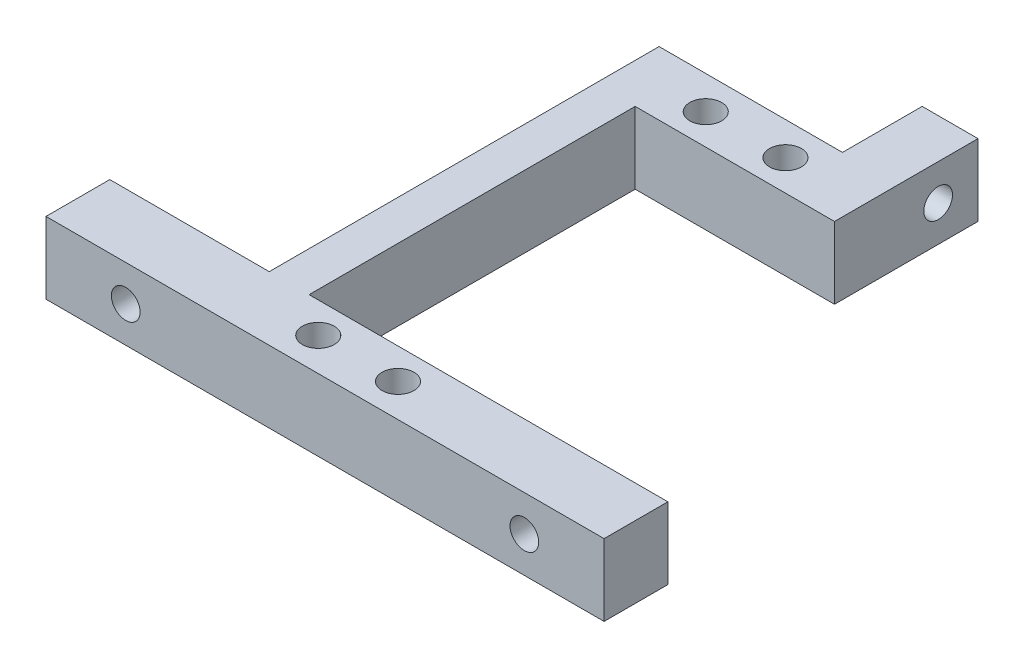
ISO-10303-21;
HEADER;
FILE_DESCRIPTION(('STEP AP214'),'2;1');
FILE_NAME('part.step','',(''),(''),'','','');
FILE_SCHEMA(('AUTOMOTIVE_DESIGN { 1 0 10303 214 1 1 1 1 }'));
ENDSEC;
DATA;
#1=APPLICATION_CONTEXT('core data for automotive mechanical design processes');
#2=APPLICATION_PROTOCOL_DEFINITION('international standard','automotive_design',2000,#1);
#3=PRODUCT_CONTEXT('',#1,'mechanical');
#4=PRODUCT('Part','Part','',(#3));
#5=PRODUCT_RELATED_PRODUCT_CATEGORY('part','',(#4));
#6=PRODUCT_DEFINITION_FORMATION('','',#4);
#7=PRODUCT_DEFINITION_CONTEXT('part definition',#1,'design');
#8=PRODUCT_DEFINITION('design','',#6,#7);
#9=PRODUCT_DEFINITION_SHAPE('','',#8);
#10=(LENGTH_UNIT() NAMED_UNIT(*) SI_UNIT(.MILLI.,.METRE.));
#11=(NAMED_UNIT(*) PLANE_ANGLE_UNIT() SI_UNIT($,.RADIAN.));
#12=(NAMED_UNIT(*) SI_UNIT($,.STERADIAN.) SOLID_ANGLE_UNIT());
#13=UNCERTAINTY_MEASURE_WITH_UNIT(LENGTH_MEASURE(1.E-05),#10,'distance_accuracy_value','');
#14=(GEOMETRIC_REPRESENTATION_CONTEXT(3) GLOBAL_UNCERTAINTY_ASSIGNED_CONTEXT((#13)) GLOBAL_UNIT_ASSIGNED_CONTEXT((#10,
#11,#12)) REPRESENTATION_CONTEXT('',''));
#15=CARTESIAN_POINT('',(0.,0.,0.));
#16=DIRECTION('',(0.,0.,1.));
#17=DIRECTION('',(1.,0.,0.));
#18=AXIS2_PLACEMENT_3D('',#15,#16,#17);
#19=CARTESIAN_POINT('',(0.,0.,-48.9));
#20=DIRECTION('',(0.,0.,-1.));
#21=DIRECTION('',(-1.,0.,0.));
#22=AXIS2_PLACEMENT_3D('',#19,#20,#21);
#23=PLANE('',#22);
#24=DIRECTION('',(-1.,0.,0.));
#25=VECTOR('',#24,1.);
#26=CARTESIAN_POINT('',(0.,9.,-48.9));
#27=LINE('',#26,#25);
#28=CARTESIAN_POINT('',(43.,9.00000000000001,-48.9));
#29=VERTEX_POINT('',#28);
#30=CARTESIAN_POINT('',(20.,9.00000000000001,-48.9));
#31=VERTEX_POINT('',#30);
#32=EDGE_CURVE('E189',#29,#31,#27,.T.);
#33=ORIENTED_EDGE('',*,*,#32,.F.);
#34=DIRECTION('',(0.,-1.,0.));
#35=VECTOR('',#34,1.);
#36=CARTESIAN_POINT('',(43.,9.00000000000001,-48.9));
#37=LINE('',#36,#35);
#38=CARTESIAN_POINT('',(43.,0.,-48.9));
#39=VERTEX_POINT('',#38);
#40=EDGE_CURVE('E153',#29,#39,#37,.T.);
#41=ORIENTED_EDGE('',*,*,#40,.T.);
#42=DIRECTION('',(-1.,0.,0.));
#43=VECTOR('',#42,1.);
#44=CARTESIAN_POINT('',(0.,0.,-48.9));
#45=LINE('',#44,#43);
#46=CARTESIAN_POINT('',(20.,0.,-48.9));
#47=VERTEX_POINT('',#46);
#48=EDGE_CURVE('E152',#39,#47,#45,.T.);
#49=ORIENTED_EDGE('',*,*,#48,.T.);
#50=DIRECTION('',(0.,1.,0.));
#51=VECTOR('',#50,1.);
#52=CARTESIAN_POINT('',(20.,0.,-48.9));
#53=LINE('',#52,#51);
#54=EDGE_CURVE('E204',#47,#31,#53,.T.);
#55=ORIENTED_EDGE('',*,*,#54,.T.);
#56=EDGE_LOOP('',(#33,#41,#49,#55));
#57=FACE_BOUND('',#56,.T.);
#58=ADVANCED_FACE('F43',(#57),#23,.T.);
#59=CARTESIAN_POINT('',(0.,0.,0.));
#60=DIRECTION('',(0.,0.,-1.));
#61=DIRECTION('',(-1.,0.,0.));
#62=AXIS2_PLACEMENT_3D('',#59,#60,#61);
#63=PLANE('',#62);
#64=CARTESIAN_POINT('',(10.,4.5,0.));
#65=DIRECTION('',(0.,0.,1.));
#66=DIRECTION('',(1.,0.,0.));
#67=AXIS2_PLACEMENT_3D('',#64,#65,#66);
#68=CIRCLE('',#67,1.79999999999999);
#69=CARTESIAN_POINT('',(11.8,4.5,0.));
#70=VERTEX_POINT('',#69);
#71=EDGE_CURVE('E224',#70,#70,#68,.T.);
#72=ORIENTED_EDGE('',*,*,#71,.T.);
#73=EDGE_LOOP('',(#72));
#74=FACE_BOUND('',#73,.T.);
#75=DIRECTION('',(-1.,0.,0.));
#76=VECTOR('',#75,1.);
#77=CARTESIAN_POINT('',(0.,9.,0.));
#78=LINE('',#77,#76);
#79=CARTESIAN_POINT('',(20.,9.00000000000001,0.));
#80=VERTEX_POINT('',#79);
#81=CARTESIAN_POINT('',(0.,9.,0.));
#82=VERTEX_POINT('',#81);
#83=EDGE_CURVE('E230',#80,#82,#78,.T.);
#84=ORIENTED_EDGE('',*,*,#83,.F.);
#85=DIRECTION('',(0.,1.,0.));
#86=VECTOR('',#85,1.);
#87=CARTESIAN_POINT('',(20.,0.,0.));
#88=LINE('',#87,#86);
#89=CARTESIAN_POINT('',(20.,0.,0.));
#90=VERTEX_POINT('',#89);
#91=EDGE_CURVE('E202',#90,#80,#88,.T.);
#92=ORIENTED_EDGE('',*,*,#91,.F.);
#93=DIRECTION('',(1.,0.,0.));
#94=VECTOR('',#93,1.);
#95=CARTESIAN_POINT('',(0.,0.,0.));
#96=LINE('',#95,#94);
#97=CARTESIAN_POINT('',(0.,0.,0.));
#98=VERTEX_POINT('',#97);
#99=EDGE_CURVE('E249',#98,#90,#96,.T.);
#100=ORIENTED_EDGE('',*,*,#99,.F.);
#101=DIRECTION('',(0.,-1.,0.));
#102=VECTOR('',#101,1.);
#103=CARTESIAN_POINT('',(0.,9.,0.));
#104=LINE('',#103,#102);
#105=EDGE_CURVE('E246',#82,#98,#104,.T.);
#106=ORIENTED_EDGE('',*,*,#105,.F.);
#107=EDGE_LOOP('',(#84,#92,#100,#106));
#108=FACE_BOUND('',#107,.T.);
#109=ADVANCED_FACE('F267',(#74,#108),#63,.T.);
#110=CARTESIAN_POINT('',(0.,0.,8.));
#111=DIRECTION('',(0.,0.,-1.));
#112=DIRECTION('',(-1.,0.,0.));
#113=AXIS2_PLACEMENT_3D('',#110,#111,#112);
#114=PLANE('',#113);
#115=DIRECTION('',(-1.,0.,0.));
#116=VECTOR('',#115,1.);
#117=CARTESIAN_POINT('',(0.,9.,8.));
#118=LINE('',#117,#116);
#119=CARTESIAN_POINT('',(70.,9.00000000000002,8.));
#120=VERTEX_POINT('',#119);
#121=CARTESIAN_POINT('',(0.,9.,8.));
#122=VERTEX_POINT('',#121);
#123=EDGE_CURVE('E233',#120,#122,#118,.T.);
#124=ORIENTED_EDGE('',*,*,#123,.T.);
#125=DIRECTION('',(0.,-1.,0.));
#126=VECTOR('',#125,1.);
#127=CARTESIAN_POINT('',(0.,9.,8.));
#128=LINE('',#127,#126);
#129=CARTESIAN_POINT('',(0.,0.,8.));
#130=VERTEX_POINT('',#129);
#131=EDGE_CURVE('E236',#122,#130,#128,.T.);
#132=ORIENTED_EDGE('',*,*,#131,.T.);
#133=DIRECTION('',(1.,0.,0.));
#134=VECTOR('',#133,1.);
#135=CARTESIAN_POINT('',(0.,0.,8.));
#136=LINE('',#135,#134);
#137=CARTESIAN_POINT('',(70.,0.,8.));
#138=VERTEX_POINT('',#137);
#139=EDGE_CURVE('E239',#130,#138,#136,.T.);
#140=ORIENTED_EDGE('',*,*,#139,.T.);
#141=DIRECTION('',(0.,1.,0.));
#142=VECTOR('',#141,1.);
#143=CARTESIAN_POINT('',(70.,9.00000000000002,8.));
#144=LINE('',#143,#142);
#145=EDGE_CURVE('E241',#138,#120,#144,.T.);
#146=ORIENTED_EDGE('',*,*,#145,.T.);
#147=EDGE_LOOP('',(#124,#132,#140,#146));
#148=FACE_BOUND('',#147,.T.);
#149=CARTESIAN_POINT('',(10.,4.5,8.));
#150=DIRECTION('',(0.,0.,1.));
#151=DIRECTION('',(1.,0.,0.));
#152=AXIS2_PLACEMENT_3D('',#149,#150,#151);
#153=CIRCLE('',#152,1.79999999999999);
#154=CARTESIAN_POINT('',(11.8,4.5,8.));
#155=VERTEX_POINT('',#154);
#156=EDGE_CURVE('E227',#155,#155,#153,.T.);
#157=ORIENTED_EDGE('',*,*,#156,.F.);
#158=EDGE_LOOP('',(#157));
#159=FACE_BOUND('',#158,.T.);
#160=CARTESIAN_POINT('',(60.,4.50000000000002,8.));
#161=DIRECTION('',(0.,0.,1.));
#162=DIRECTION('',(1.,0.,0.));
#163=AXIS2_PLACEMENT_3D('',#160,#161,#162);
#164=CIRCLE('',#163,1.79999999999999);
#165=CARTESIAN_POINT('',(61.8,4.50000000000002,8.));
#166=VERTEX_POINT('',#165);
#167=EDGE_CURVE('E221',#166,#166,#164,.T.);
#168=ORIENTED_EDGE('',*,*,#167,.F.);
#169=EDGE_LOOP('',(#168));
#170=FACE_BOUND('',#169,.T.);
#171=ADVANCED_FACE('F282',(#148,#159,#170),#114,.F.);
#172=DIRECTION('',(0.,1.,0.));
#173=VECTOR('',#172,1.);
#174=CARTESIAN_POINT('',(70.,9.00000000000002,0.));
#175=LINE('',#174,#173);
#176=CARTESIAN_POINT('',(70.,0.,0.));
#177=VERTEX_POINT('',#176);
#178=CARTESIAN_POINT('',(70.,9.00000000000002,0.));
#179=VERTEX_POINT('',#178);
#180=EDGE_CURVE('E237',#177,#179,#175,.T.);
#181=ORIENTED_EDGE('',*,*,#180,.F.);
#182=CARTESIAN_POINT('',(25.,0.,0.));
#183=VERTEX_POINT('',#182);
#184=EDGE_CURVE('E248',#183,#177,#96,.T.);
#185=ORIENTED_EDGE('',*,*,#184,.F.);
#186=DIRECTION('',(0.,1.,0.));
#187=VECTOR('',#186,1.);
#188=CARTESIAN_POINT('',(25.,0.,0.));
#189=LINE('',#188,#187);
#190=CARTESIAN_POINT('',(25.,9.00000000000001,0.));
#191=VERTEX_POINT('',#190);
#192=EDGE_CURVE('E199',#183,#191,#189,.T.);
#193=ORIENTED_EDGE('',*,*,#192,.T.);
#194=EDGE_CURVE('E244',#179,#191,#78,.T.);
#195=ORIENTED_EDGE('',*,*,#194,.F.);
#196=EDGE_LOOP('',(#181,#185,#193,#195));
#197=FACE_BOUND('',#196,.T.);
#198=CARTESIAN_POINT('',(60.,4.50000000000002,0.));
#199=DIRECTION('',(0.,0.,1.));
#200=DIRECTION('',(1.,0.,0.));
#201=AXIS2_PLACEMENT_3D('',#198,#199,#200);
#202=CIRCLE('',#201,1.79999999999999);
#203=CARTESIAN_POINT('',(61.8,4.50000000000002,0.));
#204=VERTEX_POINT('',#203);
#205=EDGE_CURVE('E220',#204,#204,#202,.T.);
#206=ORIENTED_EDGE('',*,*,#205,.T.);
#207=EDGE_LOOP('',(#206));
#208=FACE_BOUND('',#207,.T.);
#209=ADVANCED_FACE('F285',(#197,#208),#63,.T.);
#210=CARTESIAN_POINT('',(0.,9.,8.));
#211=DIRECTION('',(0.,-1.,0.));
#212=DIRECTION('',(1.,0.,0.));
#213=AXIS2_PLACEMENT_3D('',#210,#211,#212);
#214=PLANE('',#213);
#215=CARTESIAN_POINT('',(30.,9.00000000000001,3.85));
#216=DIRECTION('',(0.,-1.,0.));
#217=DIRECTION('',(1.,0.,0.));
#218=AXIS2_PLACEMENT_3D('',#215,#216,#217);
#219=CIRCLE('',#218,2.);
#220=CARTESIAN_POINT('',(32.,9.00000000000001,3.85));
#221=VERTEX_POINT('',#220);
#222=EDGE_CURVE('E217',#221,#221,#219,.T.);
#223=ORIENTED_EDGE('',*,*,#222,.T.);
#224=EDGE_LOOP('',(#223));
#225=FACE_BOUND('',#224,.T.);
#226=CARTESIAN_POINT('',(40.,9.00000000000001,3.85));
#227=DIRECTION('',(0.,-1.,0.));
#228=DIRECTION('',(1.,0.,0.));
#229=AXIS2_PLACEMENT_3D('',#226,#227,#228);
#230=CIRCLE('',#229,2.);
#231=CARTESIAN_POINT('',(42.,9.00000000000001,3.85));
#232=VERTEX_POINT('',#231);
#233=EDGE_CURVE('E212',#232,#232,#230,.T.);
#234=ORIENTED_EDGE('',*,*,#233,.T.);
#235=EDGE_LOOP('',(#234));
#236=FACE_BOUND('',#235,.T.);
#237=ORIENTED_EDGE('',*,*,#194,.T.);
#238=DIRECTION('',(0.,0.,-1.));
#239=VECTOR('',#238,1.);
#240=CARTESIAN_POINT('',(25.,9.00000000000001,0.));
#241=LINE('',#240,#239);
#242=CARTESIAN_POINT('',(25.,9.00000000000001,-40.9));
#243=VERTEX_POINT('',#242);
#244=EDGE_CURVE('E171',#191,#243,#241,.T.);
#245=ORIENTED_EDGE('',*,*,#244,.T.);
#246=DIRECTION('',(-1.,0.,0.));
#247=VECTOR('',#246,1.);
#248=CARTESIAN_POINT('',(0.,9.,-40.9));
#249=LINE('',#248,#247);
#250=CARTESIAN_POINT('',(50.,9.00000000000001,-40.9));
#251=VERTEX_POINT('',#250);
#252=EDGE_CURVE('E186',#251,#243,#249,.T.);
#253=ORIENTED_EDGE('',*,*,#252,.F.);
#254=DIRECTION('',(0.,0.,1.));
#255=VECTOR('',#254,1.);
#256=CARTESIAN_POINT('',(50.,9.00000000000001,-48.9));
#257=LINE('',#256,#255);
#258=CARTESIAN_POINT('',(50.,9.00000000000001,-58.9));
#259=VERTEX_POINT('',#258);
#260=EDGE_CURVE('E161',#259,#251,#257,.T.);
#261=ORIENTED_EDGE('',*,*,#260,.F.);
#262=DIRECTION('',(1.,0.,0.));
#263=VECTOR('',#262,1.);
#264=CARTESIAN_POINT('',(43.,9.00000000000001,-58.9));
#265=LINE('',#264,#263);
#266=CARTESIAN_POINT('',(43.,9.00000000000001,-58.9));
#267=VERTEX_POINT('',#266);
#268=EDGE_CURVE('E142',#267,#259,#265,.T.);
#269=ORIENTED_EDGE('',*,*,#268,.F.);
#270=DIRECTION('',(0.,0.,1.));
#271=VECTOR('',#270,1.);
#272=CARTESIAN_POINT('',(43.,9.00000000000001,-48.9));
#273=LINE('',#272,#271);
#274=EDGE_CURVE('E143',#267,#29,#273,.T.);
#275=ORIENTED_EDGE('',*,*,#274,.T.);
#276=ORIENTED_EDGE('',*,*,#32,.T.);
#277=DIRECTION('',(0.,0.,-1.));
#278=VECTOR('',#277,1.);
#279=CARTESIAN_POINT('',(20.,9.00000000000001,0.));
#280=LINE('',#279,#278);
#281=EDGE_CURVE('E191',#80,#31,#280,.T.);
#282=ORIENTED_EDGE('',*,*,#281,.F.);
#283=ORIENTED_EDGE('',*,*,#83,.T.);
#284=DIRECTION('',(0.,0.,-1.));
#285=VECTOR('',#284,1.);
#286=CARTESIAN_POINT('',(0.,9.,8.));
#287=LINE('',#286,#285);
#288=EDGE_CURVE('E11',#122,#82,#287,.T.);
#289=ORIENTED_EDGE('',*,*,#288,.F.);
#290=ORIENTED_EDGE('',*,*,#123,.F.);
#291=DIRECTION('',(0.,0.,-1.));
#292=VECTOR('',#291,1.);
#293=CARTESIAN_POINT('',(70.,9.00000000000002,8.));
#294=LINE('',#293,#292);
#295=EDGE_CURVE('E243',#120,#179,#294,.T.);
#296=ORIENTED_EDGE('',*,*,#295,.T.);
#297=EDGE_LOOP('',(#237,#245,#253,#261,#269,#275,#276,#282,#283,#289,#290,#296));
#298=FACE_BOUND('',#297,.T.);
#299=CARTESIAN_POINT('',(40.,9.00000000000001,-44.75));
#300=DIRECTION('',(0.,1.,0.));
#301=DIRECTION('',(-1.,0.,0.));
#302=AXIS2_PLACEMENT_3D('',#299,#300,#301);
#303=CIRCLE('',#302,2.);
#304=CARTESIAN_POINT('',(38.,9.00000000000001,-44.75));
#305=VERTEX_POINT('',#304);
#306=EDGE_CURVE('E166',#305,#305,#303,.T.);
#307=ORIENTED_EDGE('',*,*,#306,.F.);
#308=EDGE_LOOP('',(#307));
#309=FACE_BOUND('',#308,.T.);
#310=CARTESIAN_POINT('',(30.,9.00000000000001,-44.75));
#311=DIRECTION('',(0.,1.,0.));
#312=DIRECTION('',(-1.,0.,0.));
#313=AXIS2_PLACEMENT_3D('',#310,#311,#312);
#314=CIRCLE('',#313,2.00000000000002);
#315=CARTESIAN_POINT('',(28.,9.00000000000001,-44.75));
#316=VERTEX_POINT('',#315);
#317=EDGE_CURVE('E183',#316,#316,#314,.T.);
#318=ORIENTED_EDGE('',*,*,#317,.F.);
#319=EDGE_LOOP('',(#318));
#320=FACE_BOUND('',#319,.T.);
#321=ADVANCED_FACE('F45',(#225,#236,#298,#309,#320),#214,.F.);
#322=CARTESIAN_POINT('',(0.,9.,8.));
#323=DIRECTION('',(1.,0.,0.));
#324=DIRECTION('',(0.,1.,0.));
#325=AXIS2_PLACEMENT_3D('',#322,#323,#324);
#326=PLANE('',#325);
#327=ORIENTED_EDGE('',*,*,#105,.T.);
#328=DIRECTION('',(0.,0.,-1.));
#329=VECTOR('',#328,1.);
#330=CARTESIAN_POINT('',(0.,0.,8.));
#331=LINE('',#330,#329);
#332=EDGE_CURVE('E51',#130,#98,#331,.T.);
#333=ORIENTED_EDGE('',*,*,#332,.F.);
#334=ORIENTED_EDGE('',*,*,#131,.F.);
#335=ORIENTED_EDGE('',*,*,#288,.T.);
#336=EDGE_LOOP('',(#327,#333,#334,#335));
#337=FACE_BOUND('',#336,.T.);
#338=ADVANCED_FACE('F329',(#337),#326,.F.);
#339=CARTESIAN_POINT('',(0.,0.,8.));
#340=DIRECTION('',(0.,1.,0.));
#341=DIRECTION('',(-1.,0.,0.));
#342=AXIS2_PLACEMENT_3D('',#339,#340,#341);
#343=PLANE('',#342);
#344=ORIENTED_EDGE('',*,*,#184,.T.);
#345=DIRECTION('',(0.,0.,-1.));
#346=VECTOR('',#345,1.);
#347=CARTESIAN_POINT('',(70.,0.,8.));
#348=LINE('',#347,#346);
#349=EDGE_CURVE('E255',#138,#177,#348,.T.);
#350=ORIENTED_EDGE('',*,*,#349,.F.);
#351=ORIENTED_EDGE('',*,*,#139,.F.);
#352=ORIENTED_EDGE('',*,*,#332,.T.);
#353=ORIENTED_EDGE('',*,*,#99,.T.);
#354=DIRECTION('',(0.,0.,-1.));
#355=VECTOR('',#354,1.);
#356=CARTESIAN_POINT('',(20.,0.,0.));
#357=LINE('',#356,#355);
#358=EDGE_CURVE('E177',#90,#47,#357,.T.);
#359=ORIENTED_EDGE('',*,*,#358,.T.);
#360=ORIENTED_EDGE('',*,*,#48,.F.);
#361=DIRECTION('',(0.,0.,-1.));
#362=VECTOR('',#361,1.);
#363=CARTESIAN_POINT('',(43.,0.,-48.9));
#364=LINE('',#363,#362);
#365=CARTESIAN_POINT('',(43.,0.,-58.9));
#366=VERTEX_POINT('',#365);
#367=EDGE_CURVE('E58',#39,#366,#364,.T.);
#368=ORIENTED_EDGE('',*,*,#367,.T.);
#369=DIRECTION('',(1.,0.,0.));
#370=VECTOR('',#369,1.);
#371=CARTESIAN_POINT('',(43.,0.,-58.9));
#372=LINE('',#371,#370);
#373=CARTESIAN_POINT('',(50.,0.,-58.9));
#374=VERTEX_POINT('',#373);
#375=EDGE_CURVE('E134',#366,#374,#372,.T.);
#376=ORIENTED_EDGE('',*,*,#375,.T.);
#377=DIRECTION('',(0.,0.,1.));
#378=VECTOR('',#377,1.);
#379=CARTESIAN_POINT('',(50.,0.,7.99999999999999));
#380=LINE('',#379,#378);
#381=CARTESIAN_POINT('',(50.,0.,-40.9));
#382=VERTEX_POINT('',#381);
#383=EDGE_CURVE('E164',#374,#382,#380,.T.);
#384=ORIENTED_EDGE('',*,*,#383,.T.);
#385=DIRECTION('',(-1.,0.,0.));
#386=VECTOR('',#385,1.);
#387=CARTESIAN_POINT('',(0.,0.,-40.9));
#388=LINE('',#387,#386);
#389=CARTESIAN_POINT('',(25.,0.,-40.9));
#390=VERTEX_POINT('',#389);
#391=EDGE_CURVE('E174',#382,#390,#388,.T.);
#392=ORIENTED_EDGE('',*,*,#391,.T.);
#393=DIRECTION('',(0.,0.,-1.));
#394=VECTOR('',#393,1.);
#395=CARTESIAN_POINT('',(25.,0.,0.));
#396=LINE('',#395,#394);
#397=EDGE_CURVE('E66',#183,#390,#396,.T.);
#398=ORIENTED_EDGE('',*,*,#397,.F.);
#399=EDGE_LOOP('',(#344,#350,#351,#352,#353,#359,#360,#368,#376,#384,#392,#398));
#400=FACE_BOUND('',#399,.T.);
#401=CARTESIAN_POINT('',(30.,0.,3.85));
#402=DIRECTION('',(0.,-1.,0.));
#403=DIRECTION('',(1.,0.,0.));
#404=AXIS2_PLACEMENT_3D('',#401,#402,#403);
#405=CIRCLE('',#404,2.);
#406=CARTESIAN_POINT('',(32.,0.,3.85));
#407=VERTEX_POINT('',#406);
#408=EDGE_CURVE('E209',#407,#407,#405,.T.);
#409=ORIENTED_EDGE('',*,*,#408,.F.);
#410=EDGE_LOOP('',(#409));
#411=FACE_BOUND('',#410,.T.);
#412=CARTESIAN_POINT('',(40.,0.,3.85));
#413=DIRECTION('',(0.,-1.,0.));
#414=DIRECTION('',(1.,0.,0.));
#415=AXIS2_PLACEMENT_3D('',#412,#413,#414);
#416=CIRCLE('',#415,2.);
#417=CARTESIAN_POINT('',(42.,0.,3.85));
#418=VERTEX_POINT('',#417);
#419=EDGE_CURVE('E198',#418,#418,#416,.T.);
#420=ORIENTED_EDGE('',*,*,#419,.F.);
#421=EDGE_LOOP('',(#420));
#422=FACE_BOUND('',#421,.T.);
#423=CARTESIAN_POINT('',(40.,0.,-44.75));
#424=DIRECTION('',(0.,1.,0.));
#425=DIRECTION('',(-1.,0.,0.));
#426=AXIS2_PLACEMENT_3D('',#423,#424,#425);
#427=CIRCLE('',#426,2.);
#428=CARTESIAN_POINT('',(38.,0.,-44.75));
#429=VERTEX_POINT('',#428);
#430=EDGE_CURVE('E167',#429,#429,#427,.T.);
#431=ORIENTED_EDGE('',*,*,#430,.T.);
#432=EDGE_LOOP('',(#431));
#433=FACE_BOUND('',#432,.T.);
#434=CARTESIAN_POINT('',(30.,0.,-44.75));
#435=DIRECTION('',(0.,1.,0.));
#436=DIRECTION('',(-1.,0.,0.));
#437=AXIS2_PLACEMENT_3D('',#434,#435,#436);
#438=CIRCLE('',#437,2.00000000000002);
#439=CARTESIAN_POINT('',(28.,0.,-44.75));
#440=VERTEX_POINT('',#439);
#441=EDGE_CURVE('E170',#440,#440,#438,.T.);
#442=ORIENTED_EDGE('',*,*,#441,.T.);
#443=EDGE_LOOP('',(#442));
#444=FACE_BOUND('',#443,.T.);
#445=ADVANCED_FACE('F149',(#400,#411,#422,#433,#444),#343,.F.);
#446=CARTESIAN_POINT('',(70.,9.00000000000002,8.));
#447=DIRECTION('',(-1.,0.,0.));
#448=DIRECTION('',(0.,0.,1.));
#449=AXIS2_PLACEMENT_3D('',#446,#447,#448);
#450=PLANE('',#449);
#451=ORIENTED_EDGE('',*,*,#180,.T.);
#452=ORIENTED_EDGE('',*,*,#295,.F.);
#453=ORIENTED_EDGE('',*,*,#145,.F.);
#454=ORIENTED_EDGE('',*,*,#349,.T.);
#455=EDGE_LOOP('',(#451,#452,#453,#454));
#456=FACE_BOUND('',#455,.T.);
#457=ADVANCED_FACE('F318',(#456),#450,.F.);
#458=CARTESIAN_POINT('',(10.,4.5,8.));
#459=DIRECTION('',(0.,0.,-1.));
#460=DIRECTION('',(-1.,0.,0.));
#461=AXIS2_PLACEMENT_3D('',#458,#459,#460);
#462=CYLINDRICAL_SURFACE('',#461,1.79999999999999);
#463=ORIENTED_EDGE('',*,*,#156,.T.);
#464=EDGE_LOOP('',(#463));
#465=FACE_BOUND('',#464,.T.);
#466=ORIENTED_EDGE('',*,*,#71,.F.);
#467=EDGE_LOOP('',(#466));
#468=FACE_BOUND('',#467,.T.);
#469=ADVANCED_FACE('F314',(#465,#468),#462,.F.);
#470=CARTESIAN_POINT('',(60.,4.50000000000002,8.));
#471=DIRECTION('',(0.,0.,-1.));
#472=DIRECTION('',(-1.,0.,0.));
#473=AXIS2_PLACEMENT_3D('',#470,#471,#472);
#474=CYLINDRICAL_SURFACE('',#473,1.79999999999999);
#475=ORIENTED_EDGE('',*,*,#167,.T.);
#476=EDGE_LOOP('',(#475));
#477=FACE_BOUND('',#476,.T.);
#478=ORIENTED_EDGE('',*,*,#205,.F.);
#479=EDGE_LOOP('',(#478));
#480=FACE_BOUND('',#479,.T.);
#481=ADVANCED_FACE('F310',(#477,#480),#474,.F.);
#482=CARTESIAN_POINT('',(40.,10.,3.85));
#483=DIRECTION('',(0.,-1.,0.));
#484=DIRECTION('',(1.,0.,0.));
#485=AXIS2_PLACEMENT_3D('',#482,#483,#484);
#486=CYLINDRICAL_SURFACE('',#485,2.);
#487=ORIENTED_EDGE('',*,*,#419,.T.);
#488=EDGE_LOOP('',(#487));
#489=FACE_BOUND('',#488,.T.);
#490=ORIENTED_EDGE('',*,*,#233,.F.);
#491=EDGE_LOOP('',(#490));
#492=FACE_BOUND('',#491,.T.);
#493=ADVANCED_FACE('F306',(#489,#492),#486,.F.);
#494=CARTESIAN_POINT('',(30.,10.,3.85));
#495=DIRECTION('',(0.,-1.,0.));
#496=DIRECTION('',(1.,0.,0.));
#497=AXIS2_PLACEMENT_3D('',#494,#495,#496);
#498=CYLINDRICAL_SURFACE('',#497,2.);
#499=ORIENTED_EDGE('',*,*,#408,.T.);
#500=EDGE_LOOP('',(#499));
#501=FACE_BOUND('',#500,.T.);
#502=ORIENTED_EDGE('',*,*,#222,.F.);
#503=EDGE_LOOP('',(#502));
#504=FACE_BOUND('',#503,.T.);
#505=ADVANCED_FACE('F293',(#501,#504),#498,.F.);
#506=CARTESIAN_POINT('',(0.,0.,-40.9));
#507=DIRECTION('',(0.,0.,-1.));
#508=DIRECTION('',(-1.,0.,0.));
#509=AXIS2_PLACEMENT_3D('',#506,#507,#508);
#510=PLANE('',#509);
#511=ORIENTED_EDGE('',*,*,#252,.T.);
#512=DIRECTION('',(0.,1.,0.));
#513=VECTOR('',#512,1.);
#514=CARTESIAN_POINT('',(25.,0.,-40.9));
#515=LINE('',#514,#513);
#516=EDGE_CURVE('E196',#390,#243,#515,.T.);
#517=ORIENTED_EDGE('',*,*,#516,.F.);
#518=ORIENTED_EDGE('',*,*,#391,.F.);
#519=DIRECTION('',(0.,1.,0.));
#520=VECTOR('',#519,1.);
#521=CARTESIAN_POINT('',(50.,0.,-40.9));
#522=LINE('',#521,#520);
#523=EDGE_CURVE('E180',#382,#251,#522,.T.);
#524=ORIENTED_EDGE('',*,*,#523,.T.);
#525=EDGE_LOOP('',(#511,#517,#518,#524));
#526=FACE_BOUND('',#525,.T.);
#527=ADVANCED_FACE('F289',(#526),#510,.F.);
#528=CARTESIAN_POINT('',(25.,0.,0.));
#529=DIRECTION('',(1.,0.,0.));
#530=DIRECTION('',(0.,1.,0.));
#531=AXIS2_PLACEMENT_3D('',#528,#529,#530);
#532=PLANE('',#531);
#533=ORIENTED_EDGE('',*,*,#244,.F.);
#534=ORIENTED_EDGE('',*,*,#192,.F.);
#535=ORIENTED_EDGE('',*,*,#397,.T.);
#536=ORIENTED_EDGE('',*,*,#516,.T.);
#537=EDGE_LOOP('',(#533,#534,#535,#536));
#538=FACE_BOUND('',#537,.T.);
#539=ADVANCED_FACE('F292',(#538),#532,.T.);
#540=CARTESIAN_POINT('',(20.,0.,0.));
#541=DIRECTION('',(1.,0.,0.));
#542=DIRECTION('',(0.,1.,0.));
#543=AXIS2_PLACEMENT_3D('',#540,#541,#542);
#544=PLANE('',#543);
#545=ORIENTED_EDGE('',*,*,#281,.T.);
#546=ORIENTED_EDGE('',*,*,#54,.F.);
#547=ORIENTED_EDGE('',*,*,#358,.F.);
#548=ORIENTED_EDGE('',*,*,#91,.T.);
#549=EDGE_LOOP('',(#545,#546,#547,#548));
#550=FACE_BOUND('',#549,.T.);
#551=ADVANCED_FACE('F270',(#550),#544,.F.);
#552=CARTESIAN_POINT('',(30.,0.,-44.75));
#553=DIRECTION('',(0.,1.,0.));
#554=DIRECTION('',(-1.,0.,0.));
#555=AXIS2_PLACEMENT_3D('',#552,#553,#554);
#556=CYLINDRICAL_SURFACE('',#555,2.00000000000002);
#557=ORIENTED_EDGE('',*,*,#441,.F.);
#558=EDGE_LOOP('',(#557));
#559=FACE_BOUND('',#558,.T.);
#560=ORIENTED_EDGE('',*,*,#317,.T.);
#561=EDGE_LOOP('',(#560));
#562=FACE_BOUND('',#561,.T.);
#563=ADVANCED_FACE('F295',(#559,#562),#556,.F.);
#564=CARTESIAN_POINT('',(40.,0.,-44.75));
#565=DIRECTION('',(0.,1.,0.));
#566=DIRECTION('',(-1.,0.,0.));
#567=AXIS2_PLACEMENT_3D('',#564,#565,#566);
#568=CYLINDRICAL_SURFACE('',#567,2.);
#569=ORIENTED_EDGE('',*,*,#430,.F.);
#570=EDGE_LOOP('',(#569));
#571=FACE_BOUND('',#570,.T.);
#572=ORIENTED_EDGE('',*,*,#306,.T.);
#573=EDGE_LOOP('',(#572));
#574=FACE_BOUND('',#573,.T.);
#575=ADVANCED_FACE('F298',(#571,#574),#568,.F.);
#576=CARTESIAN_POINT('',(50.,-0.999999999999985,-48.9));
#577=DIRECTION('',(-1.,0.,0.));
#578=DIRECTION('',(0.,-1.,0.));
#579=AXIS2_PLACEMENT_3D('',#576,#577,#578);
#580=PLANE('',#579);
#581=ORIENTED_EDGE('',*,*,#383,.F.);
#582=DIRECTION('',(0.,1.,0.));
#583=VECTOR('',#582,1.);
#584=CARTESIAN_POINT('',(50.,9.00000000000001,-58.9));
#585=LINE('',#584,#583);
#586=EDGE_CURVE('E140',#374,#259,#585,.T.);
#587=ORIENTED_EDGE('',*,*,#586,.T.);
#588=ORIENTED_EDGE('',*,*,#260,.T.);
#589=ORIENTED_EDGE('',*,*,#523,.F.);
#590=EDGE_LOOP('',(#581,#587,#588,#589));
#591=FACE_BOUND('',#590,.T.);
#592=CARTESIAN_POINT('',(50.,4.50000000000002,-53.9));
#593=DIRECTION('',(1.,0.,0.));
#594=DIRECTION('',(0.,1.,0.));
#595=AXIS2_PLACEMENT_3D('',#592,#593,#594);
#596=CIRCLE('',#595,1.8);
#597=CARTESIAN_POINT('',(50.,6.30000000000002,-53.9));
#598=VERTEX_POINT('',#597);
#599=EDGE_CURVE('E354',#598,#598,#596,.T.);
#600=ORIENTED_EDGE('',*,*,#599,.F.);
#601=EDGE_LOOP('',(#600));
#602=FACE_BOUND('',#601,.T.);
#603=ADVANCED_FACE('F302',(#591,#602),#580,.F.);
#604=CARTESIAN_POINT('',(43.,9.00000000000001,-58.9));
#605=DIRECTION('',(0.,0.,-1.));
#606=DIRECTION('',(-1.,0.,0.));
#607=AXIS2_PLACEMENT_3D('',#604,#605,#606);
#608=PLANE('',#607);
#609=ORIENTED_EDGE('',*,*,#586,.F.);
#610=ORIENTED_EDGE('',*,*,#375,.F.);
#611=DIRECTION('',(0.,1.,0.));
#612=VECTOR('',#611,1.);
#613=CARTESIAN_POINT('',(43.,9.00000000000001,-58.9));
#614=LINE('',#613,#612);
#615=EDGE_CURVE('E137',#366,#267,#614,.T.);
#616=ORIENTED_EDGE('',*,*,#615,.T.);
#617=ORIENTED_EDGE('',*,*,#268,.T.);
#618=EDGE_LOOP('',(#609,#610,#616,#617));
#619=FACE_BOUND('',#618,.T.);
#620=ADVANCED_FACE('F135',(#619),#608,.T.);
#621=CARTESIAN_POINT('',(43.,0.,0.));
#622=DIRECTION('',(1.,0.,0.));
#623=DIRECTION('',(0.,0.,-1.));
#624=AXIS2_PLACEMENT_3D('',#621,#622,#623);
#625=PLANE('',#624);
#626=CARTESIAN_POINT('',(43.,4.50000000000001,-53.9));
#627=DIRECTION('',(1.,0.,0.));
#628=DIRECTION('',(0.,1.,0.));
#629=AXIS2_PLACEMENT_3D('',#626,#627,#628);
#630=CIRCLE('',#629,1.8);
#631=CARTESIAN_POINT('',(43.,6.30000000000001,-53.9));
#632=VERTEX_POINT('',#631);
#633=EDGE_CURVE('E160',#632,#632,#630,.T.);
#634=ORIENTED_EDGE('',*,*,#633,.T.);
#635=EDGE_LOOP('',(#634));
#636=FACE_BOUND('',#635,.T.);
#637=ORIENTED_EDGE('',*,*,#40,.F.);
#638=ORIENTED_EDGE('',*,*,#274,.F.);
#639=ORIENTED_EDGE('',*,*,#615,.F.);
#640=ORIENTED_EDGE('',*,*,#367,.F.);
#641=EDGE_LOOP('',(#637,#638,#639,#640));
#642=FACE_BOUND('',#641,.T.);
#643=ADVANCED_FACE('F145',(#636,#642),#625,.F.);
#644=CARTESIAN_POINT('',(43.,4.50000000000001,-53.9));
#645=DIRECTION('',(1.,0.,0.));
#646=DIRECTION('',(0.,1.,0.));
#647=AXIS2_PLACEMENT_3D('',#644,#645,#646);
#648=CYLINDRICAL_SURFACE('',#647,1.8);
#649=ORIENTED_EDGE('',*,*,#633,.F.);
#650=EDGE_LOOP('',(#649));
#651=FACE_BOUND('',#650,.T.);
#652=ORIENTED_EDGE('',*,*,#599,.T.);
#653=EDGE_LOOP('',(#652));
#654=FACE_BOUND('',#653,.T.);
#655=ADVANCED_FACE('F361',(#651,#654),#648,.F.);
#656=CLOSED_SHELL('',(#58,#109,#171,#209,#321,#338,#445,#457,#469,#481,#493,#505,#527,#539,#551,
#563,#575,#603,#620,#643,#655));
#657=MANIFOLD_SOLID_BREP('B2',#656);
#658=ADVANCED_BREP_SHAPE_REPRESENTATION('',(#18,#657),#14);
#659=SHAPE_DEFINITION_REPRESENTATION(#9,#658);
ENDSEC;
END-ISO-10303-21;
